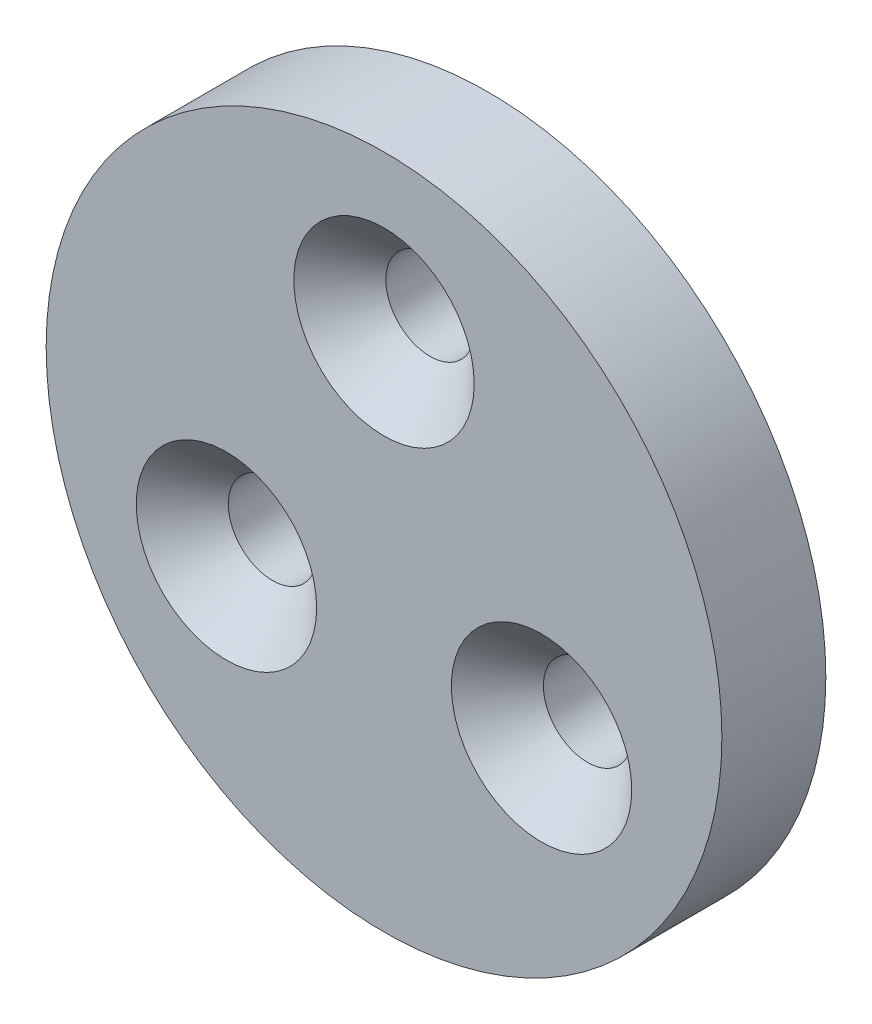
ISO-10303-21;
HEADER;
FILE_DESCRIPTION(('STEP AP214'),'2;1');
FILE_NAME('part.step','',(''),(''),'','','');
FILE_SCHEMA(('AUTOMOTIVE_DESIGN { 1 0 10303 214 1 1 1 1 }'));
ENDSEC;
DATA;
#1=APPLICATION_CONTEXT('core data for automotive mechanical design processes');
#2=APPLICATION_PROTOCOL_DEFINITION('international standard','automotive_design',2000,#1);
#3=PRODUCT_CONTEXT('',#1,'mechanical');
#4=PRODUCT('Part','Part','',(#3));
#5=PRODUCT_RELATED_PRODUCT_CATEGORY('part','',(#4));
#6=PRODUCT_DEFINITION_FORMATION('','',#4);
#7=PRODUCT_DEFINITION_CONTEXT('part definition',#1,'design');
#8=PRODUCT_DEFINITION('design','',#6,#7);
#9=PRODUCT_DEFINITION_SHAPE('','',#8);
#10=(LENGTH_UNIT() NAMED_UNIT(*) SI_UNIT(.MILLI.,.METRE.));
#11=(NAMED_UNIT(*) PLANE_ANGLE_UNIT() SI_UNIT($,.RADIAN.));
#12=(NAMED_UNIT(*) SI_UNIT($,.STERADIAN.) SOLID_ANGLE_UNIT());
#13=UNCERTAINTY_MEASURE_WITH_UNIT(LENGTH_MEASURE(1.E-05),#10,'distance_accuracy_value','');
#14=(GEOMETRIC_REPRESENTATION_CONTEXT(3) GLOBAL_UNCERTAINTY_ASSIGNED_CONTEXT((#13)) GLOBAL_UNIT_ASSIGNED_CONTEXT((#10,
#11,#12)) REPRESENTATION_CONTEXT('',''));
#15=CARTESIAN_POINT('',(0.,0.,0.));
#16=DIRECTION('',(0.,0.,1.));
#17=DIRECTION('',(1.,0.,0.));
#18=AXIS2_PLACEMENT_3D('',#15,#16,#17);
#19=CARTESIAN_POINT('',(0.,0.,4.));
#20=DIRECTION('',(0.,0.,-1.));
#21=DIRECTION('',(-1.,0.,0.));
#22=AXIS2_PLACEMENT_3D('',#19,#20,#21);
#23=CYLINDRICAL_SURFACE('',#22,13.);
#24=CARTESIAN_POINT('',(0.,0.,4.));
#25=DIRECTION('',(0.,0.,1.));
#26=DIRECTION('',(1.,0.,0.));
#27=AXIS2_PLACEMENT_3D('',#24,#25,#26);
#28=CIRCLE('',#27,13.);
#29=CARTESIAN_POINT('',(13.,0.,4.));
#30=VERTEX_POINT('',#29);
#31=EDGE_CURVE('E10',#30,#30,#28,.T.);
#32=ORIENTED_EDGE('',*,*,#31,.F.);
#33=EDGE_LOOP('',(#32));
#34=FACE_BOUND('',#33,.T.);
#35=CARTESIAN_POINT('',(0.,0.,0.));
#36=DIRECTION('',(0.,0.,1.));
#37=DIRECTION('',(1.,0.,0.));
#38=AXIS2_PLACEMENT_3D('',#35,#36,#37);
#39=CIRCLE('',#38,13.);
#40=CARTESIAN_POINT('',(13.,0.,0.));
#41=VERTEX_POINT('',#40);
#42=EDGE_CURVE('E51',#41,#41,#39,.T.);
#43=ORIENTED_EDGE('',*,*,#42,.T.);
#44=EDGE_LOOP('',(#43));
#45=FACE_BOUND('',#44,.T.);
#46=ADVANCED_FACE('F43',(#34,#45),#23,.T.);
#47=CARTESIAN_POINT('',(0.,0.,4.));
#48=DIRECTION('',(0.,0.,1.));
#49=DIRECTION('',(1.,0.,0.));
#50=AXIS2_PLACEMENT_3D('',#47,#48,#49);
#51=PLANE('',#50);
#52=CARTESIAN_POINT('',(0.,7.,4.));
#53=DIRECTION('',(0.,0.,1.));
#54=DIRECTION('',(1.,0.,0.));
#55=AXIS2_PLACEMENT_3D('',#52,#53,#54);
#56=CIRCLE('',#55,3.47);
#57=CARTESIAN_POINT('',(3.47,7.,4.));
#58=VERTEX_POINT('',#57);
#59=EDGE_CURVE('E88',#58,#58,#56,.T.);
#60=ORIENTED_EDGE('',*,*,#59,.F.);
#61=EDGE_LOOP('',(#60));
#62=FACE_BOUND('',#61,.T.);
#63=CARTESIAN_POINT('',(6.06217782649152,-3.49999999999974,4.));
#64=DIRECTION('',(0.,0.,1.));
#65=DIRECTION('',(1.,0.,0.));
#66=AXIS2_PLACEMENT_3D('',#63,#64,#65);
#67=CIRCLE('',#66,3.47);
#68=CARTESIAN_POINT('',(9.53217782649152,-3.49999999999974,4.));
#69=VERTEX_POINT('',#68);
#70=EDGE_CURVE('E76',#69,#69,#67,.T.);
#71=ORIENTED_EDGE('',*,*,#70,.F.);
#72=EDGE_LOOP('',(#71));
#73=FACE_BOUND('',#72,.T.);
#74=CARTESIAN_POINT('',(-6.06217782649063,-3.50000000000026,4.));
#75=DIRECTION('',(0.,0.,1.));
#76=DIRECTION('',(1.,0.,0.));
#77=AXIS2_PLACEMENT_3D('',#74,#75,#76);
#78=CIRCLE('',#77,3.47);
#79=CARTESIAN_POINT('',(-2.59217782649063,-3.50000000000026,4.));
#80=VERTEX_POINT('',#79);
#81=EDGE_CURVE('E68',#80,#80,#78,.T.);
#82=ORIENTED_EDGE('',*,*,#81,.F.);
#83=EDGE_LOOP('',(#82));
#84=FACE_BOUND('',#83,.T.);
#85=ORIENTED_EDGE('',*,*,#31,.T.);
#86=EDGE_LOOP('',(#85));
#87=FACE_BOUND('',#86,.T.);
#88=ADVANCED_FACE('F95',(#62,#73,#84,#87),#51,.T.);
#89=CARTESIAN_POINT('',(0.,0.,0.));
#90=DIRECTION('',(0.,0.,1.));
#91=DIRECTION('',(1.,0.,0.));
#92=AXIS2_PLACEMENT_3D('',#89,#90,#91);
#93=PLANE('',#92);
#94=CARTESIAN_POINT('',(0.,7.,0.));
#95=DIRECTION('',(0.,0.,1.));
#96=DIRECTION('',(1.,0.,0.));
#97=AXIS2_PLACEMENT_3D('',#94,#95,#96);
#98=CIRCLE('',#97,1.69999999999999);
#99=CARTESIAN_POINT('',(1.69999999999999,7.,0.));
#100=VERTEX_POINT('',#99);
#101=EDGE_CURVE('E46',#100,#100,#98,.T.);
#102=ORIENTED_EDGE('',*,*,#101,.T.);
#103=EDGE_LOOP('',(#102));
#104=FACE_BOUND('',#103,.T.);
#105=CARTESIAN_POINT('',(6.06217782649152,-3.49999999999974,0.));
#106=DIRECTION('',(0.,0.,1.));
#107=DIRECTION('',(1.,0.,0.));
#108=AXIS2_PLACEMENT_3D('',#105,#106,#107);
#109=CIRCLE('',#108,1.69999999999999);
#110=CARTESIAN_POINT('',(7.76217782649151,-3.49999999999974,0.));
#111=VERTEX_POINT('',#110);
#112=EDGE_CURVE('E65',#111,#111,#109,.T.);
#113=ORIENTED_EDGE('',*,*,#112,.T.);
#114=EDGE_LOOP('',(#113));
#115=FACE_BOUND('',#114,.T.);
#116=CARTESIAN_POINT('',(-6.06217782649063,-3.50000000000026,0.));
#117=DIRECTION('',(0.,0.,1.));
#118=DIRECTION('',(1.,0.,0.));
#119=AXIS2_PLACEMENT_3D('',#116,#117,#118);
#120=CIRCLE('',#119,1.69999999999999);
#121=CARTESIAN_POINT('',(-4.36217782649063,-3.50000000000026,0.));
#122=VERTEX_POINT('',#121);
#123=EDGE_CURVE('E57',#122,#122,#120,.T.);
#124=ORIENTED_EDGE('',*,*,#123,.T.);
#125=EDGE_LOOP('',(#124));
#126=FACE_BOUND('',#125,.T.);
#127=ORIENTED_EDGE('',*,*,#42,.F.);
#128=EDGE_LOOP('',(#127));
#129=FACE_BOUND('',#128,.T.);
#130=ADVANCED_FACE('F98',(#104,#115,#126,#129),#93,.F.);
#131=CARTESIAN_POINT('',(-6.06217782649063,-3.50000000000026,4.));
#132=DIRECTION('',(0.,0.,1.));
#133=DIRECTION('',(1.,0.,0.));
#134=AXIS2_PLACEMENT_3D('',#131,#132,#133);
#135=CYLINDRICAL_SURFACE('',#134,1.69999999999999);
#136=CARTESIAN_POINT('',(-6.06217782649063,-3.50000000000026,2.23));
#137=DIRECTION('',(0.,0.,1.));
#138=DIRECTION('',(1.,0.,0.));
#139=AXIS2_PLACEMENT_3D('',#136,#137,#138);
#140=CIRCLE('',#139,1.7);
#141=CARTESIAN_POINT('',(-4.36217782649063,-3.50000000000026,2.23));
#142=VERTEX_POINT('',#141);
#143=EDGE_CURVE('E60',#142,#142,#140,.T.);
#144=ORIENTED_EDGE('',*,*,#143,.T.);
#145=EDGE_LOOP('',(#144));
#146=FACE_BOUND('',#145,.T.);
#147=ORIENTED_EDGE('',*,*,#123,.F.);
#148=EDGE_LOOP('',(#147));
#149=FACE_BOUND('',#148,.T.);
#150=ADVANCED_FACE('F107',(#146,#149),#135,.F.);
#151=CARTESIAN_POINT('',(-6.06217782649063,-3.50000000000026,4.));
#152=DIRECTION('',(0.,0.,1.));
#153=DIRECTION('',(1.,0.,0.));
#154=AXIS2_PLACEMENT_3D('',#151,#152,#153);
#155=CONICAL_SURFACE('',#154,3.47,0.785398163397448);
#156=ORIENTED_EDGE('',*,*,#143,.F.);
#157=EDGE_LOOP('',(#156));
#158=FACE_BOUND('',#157,.T.);
#159=ORIENTED_EDGE('',*,*,#81,.T.);
#160=EDGE_LOOP('',(#159));
#161=FACE_BOUND('',#160,.T.);
#162=ADVANCED_FACE('F104',(#158,#161),#155,.F.);
#163=CARTESIAN_POINT('',(6.06217782649152,-3.49999999999974,4.));
#164=DIRECTION('',(0.,0.,1.));
#165=DIRECTION('',(1.,0.,0.));
#166=AXIS2_PLACEMENT_3D('',#163,#164,#165);
#167=CYLINDRICAL_SURFACE('',#166,1.69999999999999);
#168=CARTESIAN_POINT('',(6.06217782649152,-3.49999999999974,2.23));
#169=DIRECTION('',(0.,0.,1.));
#170=DIRECTION('',(1.,0.,0.));
#171=AXIS2_PLACEMENT_3D('',#168,#169,#170);
#172=CIRCLE('',#171,1.7);
#173=CARTESIAN_POINT('',(7.76217782649152,-3.49999999999974,2.23));
#174=VERTEX_POINT('',#173);
#175=EDGE_CURVE('E69',#174,#174,#172,.T.);
#176=ORIENTED_EDGE('',*,*,#175,.T.);
#177=EDGE_LOOP('',(#176));
#178=FACE_BOUND('',#177,.T.);
#179=ORIENTED_EDGE('',*,*,#112,.F.);
#180=EDGE_LOOP('',(#179));
#181=FACE_BOUND('',#180,.T.);
#182=ADVANCED_FACE('F106',(#178,#181),#167,.F.);
#183=CARTESIAN_POINT('',(6.06217782649152,-3.49999999999974,4.));
#184=DIRECTION('',(0.,0.,1.));
#185=DIRECTION('',(1.,0.,0.));
#186=AXIS2_PLACEMENT_3D('',#183,#184,#185);
#187=CONICAL_SURFACE('',#186,3.47,0.785398163397448);
#188=ORIENTED_EDGE('',*,*,#175,.F.);
#189=EDGE_LOOP('',(#188));
#190=FACE_BOUND('',#189,.T.);
#191=ORIENTED_EDGE('',*,*,#70,.T.);
#192=EDGE_LOOP('',(#191));
#193=FACE_BOUND('',#192,.T.);
#194=ADVANCED_FACE('F114',(#190,#193),#187,.F.);
#195=CARTESIAN_POINT('',(0.,7.,4.));
#196=DIRECTION('',(0.,0.,1.));
#197=DIRECTION('',(1.,0.,0.));
#198=AXIS2_PLACEMENT_3D('',#195,#196,#197);
#199=CYLINDRICAL_SURFACE('',#198,1.69999999999999);
#200=CARTESIAN_POINT('',(0.,7.,2.23));
#201=DIRECTION('',(0.,0.,1.));
#202=DIRECTION('',(1.,0.,0.));
#203=AXIS2_PLACEMENT_3D('',#200,#201,#202);
#204=CIRCLE('',#203,1.7);
#205=CARTESIAN_POINT('',(1.7,7.,2.23));
#206=VERTEX_POINT('',#205);
#207=EDGE_CURVE('E84',#206,#206,#204,.T.);
#208=ORIENTED_EDGE('',*,*,#207,.T.);
#209=EDGE_LOOP('',(#208));
#210=FACE_BOUND('',#209,.T.);
#211=ORIENTED_EDGE('',*,*,#101,.F.);
#212=EDGE_LOOP('',(#211));
#213=FACE_BOUND('',#212,.T.);
#214=ADVANCED_FACE('F137',(#210,#213),#199,.F.);
#215=CARTESIAN_POINT('',(0.,7.,4.));
#216=DIRECTION('',(0.,0.,1.));
#217=DIRECTION('',(1.,0.,0.));
#218=AXIS2_PLACEMENT_3D('',#215,#216,#217);
#219=CONICAL_SURFACE('',#218,3.47,0.785398163397448);
#220=ORIENTED_EDGE('',*,*,#207,.F.);
#221=EDGE_LOOP('',(#220));
#222=FACE_BOUND('',#221,.T.);
#223=ORIENTED_EDGE('',*,*,#59,.T.);
#224=EDGE_LOOP('',(#223));
#225=FACE_BOUND('',#224,.T.);
#226=ADVANCED_FACE('F93',(#222,#225),#219,.F.);
#227=CLOSED_SHELL('',(#46,#88,#130,#150,#162,#182,#194,#214,#226));
#228=MANIFOLD_SOLID_BREP('B2',#227);
#229=ADVANCED_BREP_SHAPE_REPRESENTATION('',(#18,#228),#14);
#230=SHAPE_DEFINITION_REPRESENTATION(#9,#229);
ENDSEC;
END-ISO-10303-21;
